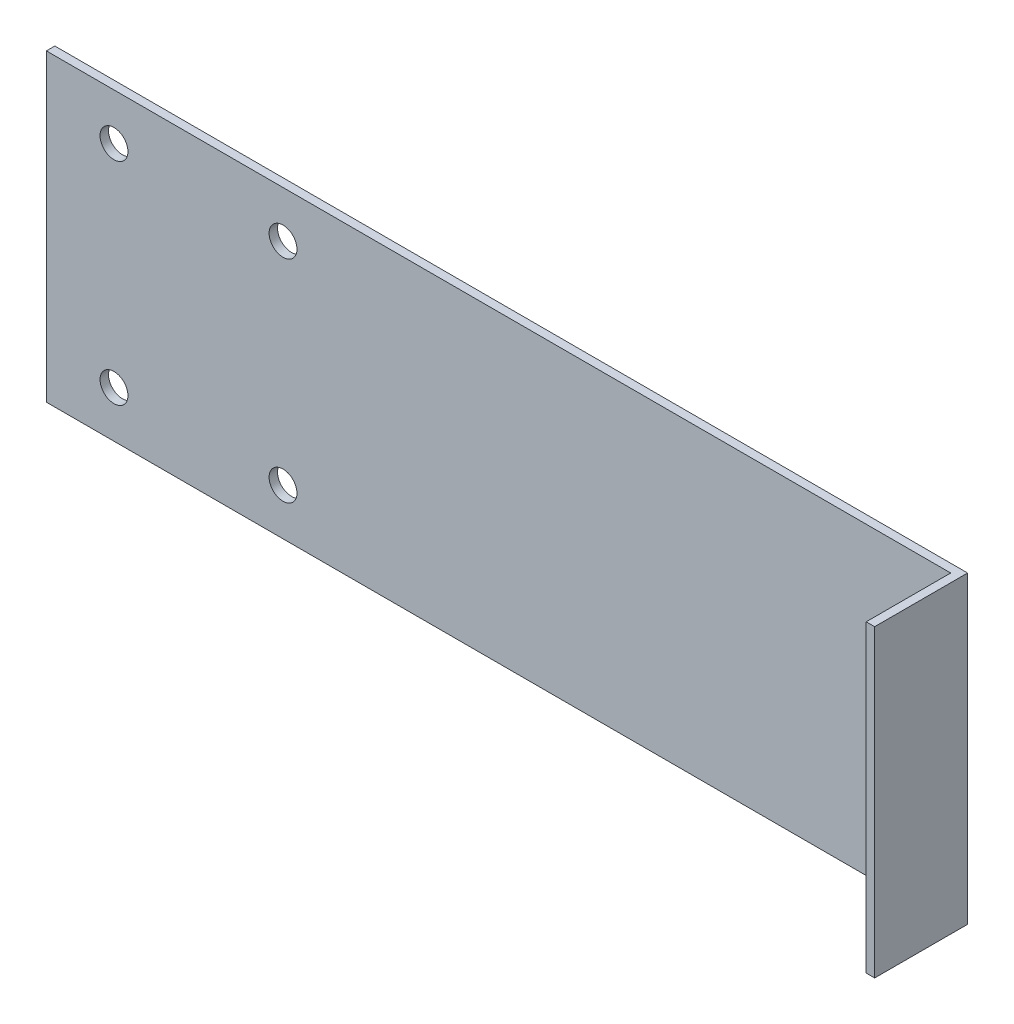
ISO-10303-21;
HEADER;
FILE_DESCRIPTION(('STEP AP214'),'2;1');
FILE_NAME('part.step','',(''),(''),'','','');
FILE_SCHEMA(('AUTOMOTIVE_DESIGN { 1 0 10303 214 1 1 1 1 }'));
ENDSEC;
DATA;
#1=APPLICATION_CONTEXT('core data for automotive mechanical design processes');
#2=APPLICATION_PROTOCOL_DEFINITION('international standard','automotive_design',2000,#1);
#3=PRODUCT_CONTEXT('',#1,'mechanical');
#4=PRODUCT('Part','Part','',(#3));
#5=PRODUCT_RELATED_PRODUCT_CATEGORY('part','',(#4));
#6=PRODUCT_DEFINITION_FORMATION('','',#4);
#7=PRODUCT_DEFINITION_CONTEXT('part definition',#1,'design');
#8=PRODUCT_DEFINITION('design','',#6,#7);
#9=PRODUCT_DEFINITION_SHAPE('','',#8);
#10=(LENGTH_UNIT() NAMED_UNIT(*) SI_UNIT(.MILLI.,.METRE.));
#11=(NAMED_UNIT(*) PLANE_ANGLE_UNIT() SI_UNIT($,.RADIAN.));
#12=(NAMED_UNIT(*) SI_UNIT($,.STERADIAN.) SOLID_ANGLE_UNIT());
#13=UNCERTAINTY_MEASURE_WITH_UNIT(LENGTH_MEASURE(1.E-05),#10,'distance_accuracy_value','');
#14=(GEOMETRIC_REPRESENTATION_CONTEXT(3) GLOBAL_UNCERTAINTY_ASSIGNED_CONTEXT((#13)) GLOBAL_UNIT_ASSIGNED_CONTEXT((#10,
#11,#12)) REPRESENTATION_CONTEXT('',''));
#15=CARTESIAN_POINT('',(0.,0.,0.));
#16=DIRECTION('',(0.,0.,1.));
#17=DIRECTION('',(1.,0.,0.));
#18=AXIS2_PLACEMENT_3D('',#15,#16,#17);
#19=CARTESIAN_POINT('',(54.,18.,1.));
#20=DIRECTION('',(-1.,0.,0.));
#21=DIRECTION('',(0.,-1.,0.));
#22=AXIS2_PLACEMENT_3D('',#19,#20,#21);
#23=PLANE('',#22);
#24=DIRECTION('',(0.,1.,0.));
#25=VECTOR('',#24,1.);
#26=CARTESIAN_POINT('',(54.,18.,0.));
#27=LINE('',#26,#25);
#28=CARTESIAN_POINT('',(54.,-18.,0.));
#29=VERTEX_POINT('',#28);
#30=CARTESIAN_POINT('',(54.,18.,0.));
#31=VERTEX_POINT('',#30);
#32=EDGE_CURVE('E96',#29,#31,#27,.T.);
#33=ORIENTED_EDGE('',*,*,#32,.T.);
#34=DIRECTION('',(0.,0.,-1.));
#35=VECTOR('',#34,1.);
#36=CARTESIAN_POINT('',(54.,18.,1.));
#37=LINE('',#36,#35);
#38=CARTESIAN_POINT('',(54.,18.,11.));
#39=VERTEX_POINT('',#38);
#40=EDGE_CURVE('E11',#39,#31,#37,.T.);
#41=ORIENTED_EDGE('',*,*,#40,.F.);
#42=DIRECTION('',(0.,1.,0.));
#43=VECTOR('',#42,1.);
#44=CARTESIAN_POINT('',(54.,18.,11.));
#45=LINE('',#44,#43);
#46=CARTESIAN_POINT('',(54.,-18.,11.));
#47=VERTEX_POINT('',#46);
#48=EDGE_CURVE('E98',#47,#39,#45,.T.);
#49=ORIENTED_EDGE('',*,*,#48,.F.);
#50=DIRECTION('',(0.,0.,-1.));
#51=VECTOR('',#50,1.);
#52=CARTESIAN_POINT('',(54.,-18.,1.));
#53=LINE('',#52,#51);
#54=EDGE_CURVE('E82',#47,#29,#53,.T.);
#55=ORIENTED_EDGE('',*,*,#54,.T.);
#56=EDGE_LOOP('',(#33,#41,#49,#55));
#57=FACE_BOUND('',#56,.T.);
#58=ADVANCED_FACE('F35',(#57),#23,.F.);
#59=CARTESIAN_POINT('',(-54.,18.,1.));
#60=DIRECTION('',(0.,-1.,0.));
#61=DIRECTION('',(0.,0.,-1.));
#62=AXIS2_PLACEMENT_3D('',#59,#60,#61);
#63=PLANE('',#62);
#64=DIRECTION('',(-1.,0.,0.));
#65=VECTOR('',#64,1.);
#66=CARTESIAN_POINT('',(-54.,18.,0.));
#67=LINE('',#66,#65);
#68=CARTESIAN_POINT('',(-54.,18.,0.));
#69=VERTEX_POINT('',#68);
#70=EDGE_CURVE('E102',#31,#69,#67,.T.);
#71=ORIENTED_EDGE('',*,*,#70,.T.);
#72=DIRECTION('',(0.,0.,-1.));
#73=VECTOR('',#72,1.);
#74=CARTESIAN_POINT('',(-54.,18.,1.));
#75=LINE('',#74,#73);
#76=CARTESIAN_POINT('',(-54.,18.,1.));
#77=VERTEX_POINT('',#76);
#78=EDGE_CURVE('E43',#77,#69,#75,.T.);
#79=ORIENTED_EDGE('',*,*,#78,.F.);
#80=DIRECTION('',(-1.,0.,0.));
#81=VECTOR('',#80,1.);
#82=CARTESIAN_POINT('',(-54.,18.,1.));
#83=LINE('',#82,#81);
#84=CARTESIAN_POINT('',(53.,18.,1.));
#85=VERTEX_POINT('',#84);
#86=EDGE_CURVE('E89',#85,#77,#83,.T.);
#87=ORIENTED_EDGE('',*,*,#86,.F.);
#88=DIRECTION('',(0.,0.,-1.));
#89=VECTOR('',#88,1.);
#90=CARTESIAN_POINT('',(53.,18.,11.));
#91=LINE('',#90,#89);
#92=CARTESIAN_POINT('',(53.,18.,11.));
#93=VERTEX_POINT('',#92);
#94=EDGE_CURVE('E134',#93,#85,#91,.T.);
#95=ORIENTED_EDGE('',*,*,#94,.F.);
#96=DIRECTION('',(-1.,0.,0.));
#97=VECTOR('',#96,1.);
#98=CARTESIAN_POINT('',(53.,18.,11.));
#99=LINE('',#98,#97);
#100=EDGE_CURVE('E147',#39,#93,#99,.T.);
#101=ORIENTED_EDGE('',*,*,#100,.F.);
#102=ORIENTED_EDGE('',*,*,#40,.T.);
#103=EDGE_LOOP('',(#71,#79,#87,#95,#101,#102));
#104=FACE_BOUND('',#103,.T.);
#105=ADVANCED_FACE('F183',(#104),#63,.F.);
#106=CARTESIAN_POINT('',(-54.,18.,1.));
#107=DIRECTION('',(1.,0.,0.));
#108=DIRECTION('',(0.,1.,0.));
#109=AXIS2_PLACEMENT_3D('',#106,#107,#108);
#110=PLANE('',#109);
#111=DIRECTION('',(0.,-1.,0.));
#112=VECTOR('',#111,1.);
#113=CARTESIAN_POINT('',(-54.,18.,0.));
#114=LINE('',#113,#112);
#115=CARTESIAN_POINT('',(-54.,-18.,0.));
#116=VERTEX_POINT('',#115);
#117=EDGE_CURVE('E90',#69,#116,#114,.T.);
#118=ORIENTED_EDGE('',*,*,#117,.T.);
#119=DIRECTION('',(0.,0.,-1.));
#120=VECTOR('',#119,1.);
#121=CARTESIAN_POINT('',(-54.,-18.,1.));
#122=LINE('',#121,#120);
#123=CARTESIAN_POINT('',(-54.,-18.,1.));
#124=VERTEX_POINT('',#123);
#125=EDGE_CURVE('E85',#124,#116,#122,.T.);
#126=ORIENTED_EDGE('',*,*,#125,.F.);
#127=DIRECTION('',(0.,-1.,0.));
#128=VECTOR('',#127,1.);
#129=CARTESIAN_POINT('',(-54.,18.,1.));
#130=LINE('',#129,#128);
#131=EDGE_CURVE('E57',#77,#124,#130,.T.);
#132=ORIENTED_EDGE('',*,*,#131,.F.);
#133=ORIENTED_EDGE('',*,*,#78,.T.);
#134=EDGE_LOOP('',(#118,#126,#132,#133));
#135=FACE_BOUND('',#134,.T.);
#136=ADVANCED_FACE('F179',(#135),#110,.F.);
#137=CARTESIAN_POINT('',(-54.,-18.,1.));
#138=DIRECTION('',(0.,1.,0.));
#139=DIRECTION('',(0.,0.,1.));
#140=AXIS2_PLACEMENT_3D('',#137,#138,#139);
#141=PLANE('',#140);
#142=DIRECTION('',(1.,0.,0.));
#143=VECTOR('',#142,1.);
#144=CARTESIAN_POINT('',(-54.,-18.,0.));
#145=LINE('',#144,#143);
#146=EDGE_CURVE('E77',#116,#29,#145,.T.);
#147=ORIENTED_EDGE('',*,*,#146,.T.);
#148=ORIENTED_EDGE('',*,*,#54,.F.);
#149=DIRECTION('',(1.,0.,0.));
#150=VECTOR('',#149,1.);
#151=CARTESIAN_POINT('',(53.,-18.,11.));
#152=LINE('',#151,#150);
#153=CARTESIAN_POINT('',(53.,-18.,11.));
#154=VERTEX_POINT('',#153);
#155=EDGE_CURVE('E129',#154,#47,#152,.T.);
#156=ORIENTED_EDGE('',*,*,#155,.F.);
#157=DIRECTION('',(0.,0.,-1.));
#158=VECTOR('',#157,1.);
#159=CARTESIAN_POINT('',(53.,-18.,11.));
#160=LINE('',#159,#158);
#161=CARTESIAN_POINT('',(53.,-18.,1.));
#162=VERTEX_POINT('',#161);
#163=EDGE_CURVE('E128',#154,#162,#160,.T.);
#164=ORIENTED_EDGE('',*,*,#163,.T.);
#165=DIRECTION('',(1.,0.,0.));
#166=VECTOR('',#165,1.);
#167=CARTESIAN_POINT('',(-54.,-18.,1.));
#168=LINE('',#167,#166);
#169=EDGE_CURVE('E99',#124,#162,#168,.T.);
#170=ORIENTED_EDGE('',*,*,#169,.F.);
#171=ORIENTED_EDGE('',*,*,#125,.T.);
#172=EDGE_LOOP('',(#147,#148,#156,#164,#170,#171));
#173=FACE_BOUND('',#172,.T.);
#174=ADVANCED_FACE('F79',(#173),#141,.F.);
#175=CARTESIAN_POINT('',(0.,0.,1.));
#176=DIRECTION('',(0.,0.,1.));
#177=DIRECTION('',(1.,0.,0.));
#178=AXIS2_PLACEMENT_3D('',#175,#176,#177);
#179=PLANE('',#178);
#180=DIRECTION('',(0.,-1.,0.));
#181=VECTOR('',#180,1.);
#182=CARTESIAN_POINT('',(53.,18.,1.));
#183=LINE('',#182,#181);
#184=EDGE_CURVE('E51',#85,#162,#183,.T.);
#185=ORIENTED_EDGE('',*,*,#184,.F.);
#186=ORIENTED_EDGE('',*,*,#86,.T.);
#187=ORIENTED_EDGE('',*,*,#131,.T.);
#188=ORIENTED_EDGE('',*,*,#169,.T.);
#189=EDGE_LOOP('',(#185,#186,#187,#188));
#190=FACE_BOUND('',#189,.T.);
#191=CARTESIAN_POINT('',(-46.,12.5,1.));
#192=DIRECTION('',(0.,0.,1.));
#193=DIRECTION('',(1.,0.,0.));
#194=AXIS2_PLACEMENT_3D('',#191,#192,#193);
#195=CIRCLE('',#194,1.64999999999999);
#196=CARTESIAN_POINT('',(-44.3500000000001,12.5,1.));
#197=VERTEX_POINT('',#196);
#198=EDGE_CURVE('E133',#197,#197,#195,.T.);
#199=ORIENTED_EDGE('',*,*,#198,.F.);
#200=EDGE_LOOP('',(#199));
#201=FACE_BOUND('',#200,.T.);
#202=CARTESIAN_POINT('',(-26.,12.5,1.));
#203=DIRECTION('',(0.,0.,1.));
#204=DIRECTION('',(1.,0.,0.));
#205=AXIS2_PLACEMENT_3D('',#202,#203,#204);
#206=CIRCLE('',#205,1.64999999999999);
#207=CARTESIAN_POINT('',(-24.3500000000001,12.5,1.));
#208=VERTEX_POINT('',#207);
#209=EDGE_CURVE('E154',#208,#208,#206,.T.);
#210=ORIENTED_EDGE('',*,*,#209,.F.);
#211=EDGE_LOOP('',(#210));
#212=FACE_BOUND('',#211,.T.);
#213=CARTESIAN_POINT('',(-46.,-12.5,1.));
#214=DIRECTION('',(0.,0.,1.));
#215=DIRECTION('',(1.,0.,0.));
#216=AXIS2_PLACEMENT_3D('',#213,#214,#215);
#217=CIRCLE('',#216,1.64999999999999);
#218=CARTESIAN_POINT('',(-44.3500000000001,-12.5,1.));
#219=VERTEX_POINT('',#218);
#220=EDGE_CURVE('E160',#219,#219,#217,.T.);
#221=ORIENTED_EDGE('',*,*,#220,.F.);
#222=EDGE_LOOP('',(#221));
#223=FACE_BOUND('',#222,.T.);
#224=CARTESIAN_POINT('',(-26.,-12.5,1.));
#225=DIRECTION('',(0.,0.,1.));
#226=DIRECTION('',(1.,0.,0.));
#227=AXIS2_PLACEMENT_3D('',#224,#225,#226);
#228=CIRCLE('',#227,1.64999999999999);
#229=CARTESIAN_POINT('',(-24.3500000000001,-12.5,1.));
#230=VERTEX_POINT('',#229);
#231=EDGE_CURVE('E107',#230,#230,#228,.T.);
#232=ORIENTED_EDGE('',*,*,#231,.F.);
#233=EDGE_LOOP('',(#232));
#234=FACE_BOUND('',#233,.T.);
#235=ADVANCED_FACE('F124',(#190,#201,#212,#223,#234),#179,.T.);
#236=CARTESIAN_POINT('',(0.,0.,0.));
#237=DIRECTION('',(0.,0.,1.));
#238=DIRECTION('',(1.,0.,0.));
#239=AXIS2_PLACEMENT_3D('',#236,#237,#238);
#240=PLANE('',#239);
#241=CARTESIAN_POINT('',(-46.,12.5,0.));
#242=DIRECTION('',(0.,0.,1.));
#243=DIRECTION('',(1.,0.,0.));
#244=AXIS2_PLACEMENT_3D('',#241,#242,#243);
#245=CIRCLE('',#244,1.64999999999999);
#246=CARTESIAN_POINT('',(-44.3500000000001,12.5,0.));
#247=VERTEX_POINT('',#246);
#248=EDGE_CURVE('E151',#247,#247,#245,.T.);
#249=ORIENTED_EDGE('',*,*,#248,.T.);
#250=EDGE_LOOP('',(#249));
#251=FACE_BOUND('',#250,.T.);
#252=CARTESIAN_POINT('',(-26.,12.5,0.));
#253=DIRECTION('',(0.,0.,1.));
#254=DIRECTION('',(1.,0.,0.));
#255=AXIS2_PLACEMENT_3D('',#252,#253,#254);
#256=CIRCLE('',#255,1.64999999999999);
#257=CARTESIAN_POINT('',(-24.3500000000001,12.5,0.));
#258=VERTEX_POINT('',#257);
#259=EDGE_CURVE('E157',#258,#258,#256,.T.);
#260=ORIENTED_EDGE('',*,*,#259,.T.);
#261=EDGE_LOOP('',(#260));
#262=FACE_BOUND('',#261,.T.);
#263=CARTESIAN_POINT('',(-46.,-12.5,0.));
#264=DIRECTION('',(0.,0.,1.));
#265=DIRECTION('',(1.,0.,0.));
#266=AXIS2_PLACEMENT_3D('',#263,#264,#265);
#267=CIRCLE('',#266,1.64999999999999);
#268=CARTESIAN_POINT('',(-44.3500000000001,-12.5,0.));
#269=VERTEX_POINT('',#268);
#270=EDGE_CURVE('E163',#269,#269,#267,.T.);
#271=ORIENTED_EDGE('',*,*,#270,.T.);
#272=EDGE_LOOP('',(#271));
#273=FACE_BOUND('',#272,.T.);
#274=CARTESIAN_POINT('',(-26.,-12.5,0.));
#275=DIRECTION('',(0.,0.,1.));
#276=DIRECTION('',(1.,0.,0.));
#277=AXIS2_PLACEMENT_3D('',#274,#275,#276);
#278=CIRCLE('',#277,1.64999999999999);
#279=CARTESIAN_POINT('',(-24.3500000000001,-12.5,0.));
#280=VERTEX_POINT('',#279);
#281=EDGE_CURVE('E103',#280,#280,#278,.T.);
#282=ORIENTED_EDGE('',*,*,#281,.T.);
#283=EDGE_LOOP('',(#282));
#284=FACE_BOUND('',#283,.T.);
#285=ORIENTED_EDGE('',*,*,#32,.F.);
#286=ORIENTED_EDGE('',*,*,#146,.F.);
#287=ORIENTED_EDGE('',*,*,#117,.F.);
#288=ORIENTED_EDGE('',*,*,#70,.F.);
#289=EDGE_LOOP('',(#285,#286,#287,#288));
#290=FACE_BOUND('',#289,.T.);
#291=ADVANCED_FACE('F101',(#251,#262,#273,#284,#290),#240,.F.);
#292=CARTESIAN_POINT('',(-26.,-12.5,1.));
#293=DIRECTION('',(0.,0.,1.));
#294=DIRECTION('',(1.,0.,0.));
#295=AXIS2_PLACEMENT_3D('',#292,#293,#294);
#296=CYLINDRICAL_SURFACE('',#295,1.64999999999999);
#297=ORIENTED_EDGE('',*,*,#231,.T.);
#298=EDGE_LOOP('',(#297));
#299=FACE_BOUND('',#298,.T.);
#300=ORIENTED_EDGE('',*,*,#281,.F.);
#301=EDGE_LOOP('',(#300));
#302=FACE_BOUND('',#301,.T.);
#303=ADVANCED_FACE('F168',(#299,#302),#296,.F.);
#304=CARTESIAN_POINT('',(-46.,-12.5,1.));
#305=DIRECTION('',(0.,0.,1.));
#306=DIRECTION('',(1.,0.,0.));
#307=AXIS2_PLACEMENT_3D('',#304,#305,#306);
#308=CYLINDRICAL_SURFACE('',#307,1.64999999999999);
#309=ORIENTED_EDGE('',*,*,#220,.T.);
#310=EDGE_LOOP('',(#309));
#311=FACE_BOUND('',#310,.T.);
#312=ORIENTED_EDGE('',*,*,#270,.F.);
#313=EDGE_LOOP('',(#312));
#314=FACE_BOUND('',#313,.T.);
#315=ADVANCED_FACE('F218',(#311,#314),#308,.F.);
#316=CARTESIAN_POINT('',(-26.,12.5,1.));
#317=DIRECTION('',(0.,0.,1.));
#318=DIRECTION('',(1.,0.,0.));
#319=AXIS2_PLACEMENT_3D('',#316,#317,#318);
#320=CYLINDRICAL_SURFACE('',#319,1.64999999999999);
#321=ORIENTED_EDGE('',*,*,#209,.T.);
#322=EDGE_LOOP('',(#321));
#323=FACE_BOUND('',#322,.T.);
#324=ORIENTED_EDGE('',*,*,#259,.F.);
#325=EDGE_LOOP('',(#324));
#326=FACE_BOUND('',#325,.T.);
#327=ADVANCED_FACE('F214',(#323,#326),#320,.F.);
#328=CARTESIAN_POINT('',(-46.,12.5,1.));
#329=DIRECTION('',(0.,0.,1.));
#330=DIRECTION('',(1.,0.,0.));
#331=AXIS2_PLACEMENT_3D('',#328,#329,#330);
#332=CYLINDRICAL_SURFACE('',#331,1.64999999999999);
#333=ORIENTED_EDGE('',*,*,#198,.T.);
#334=EDGE_LOOP('',(#333));
#335=FACE_BOUND('',#334,.T.);
#336=ORIENTED_EDGE('',*,*,#248,.F.);
#337=EDGE_LOOP('',(#336));
#338=FACE_BOUND('',#337,.T.);
#339=ADVANCED_FACE('F209',(#335,#338),#332,.F.);
#340=CARTESIAN_POINT('',(53.,18.,11.));
#341=DIRECTION('',(1.,0.,0.));
#342=DIRECTION('',(0.,1.,0.));
#343=AXIS2_PLACEMENT_3D('',#340,#341,#342);
#344=PLANE('',#343);
#345=ORIENTED_EDGE('',*,*,#184,.T.);
#346=ORIENTED_EDGE('',*,*,#163,.F.);
#347=DIRECTION('',(0.,-1.,0.));
#348=VECTOR('',#347,1.);
#349=CARTESIAN_POINT('',(53.,18.,11.));
#350=LINE('',#349,#348);
#351=EDGE_CURVE('E138',#93,#154,#350,.T.);
#352=ORIENTED_EDGE('',*,*,#351,.F.);
#353=ORIENTED_EDGE('',*,*,#94,.T.);
#354=EDGE_LOOP('',(#345,#346,#352,#353));
#355=FACE_BOUND('',#354,.T.);
#356=ADVANCED_FACE('F136',(#355),#344,.F.);
#357=CARTESIAN_POINT('',(0.,0.,11.));
#358=DIRECTION('',(0.,0.,1.));
#359=DIRECTION('',(1.,0.,0.));
#360=AXIS2_PLACEMENT_3D('',#357,#358,#359);
#361=PLANE('',#360);
#362=ORIENTED_EDGE('',*,*,#351,.T.);
#363=ORIENTED_EDGE('',*,*,#155,.T.);
#364=ORIENTED_EDGE('',*,*,#48,.T.);
#365=ORIENTED_EDGE('',*,*,#100,.T.);
#366=EDGE_LOOP('',(#362,#363,#364,#365));
#367=FACE_BOUND('',#366,.T.);
#368=ADVANCED_FACE('F199',(#367),#361,.T.);
#369=CLOSED_SHELL('',(#58,#105,#136,#174,#235,#291,#303,#315,#327,#339,#356,#368));
#370=MANIFOLD_SOLID_BREP('B2',#369);
#371=ADVANCED_BREP_SHAPE_REPRESENTATION('',(#18,#370),#14);
#372=SHAPE_DEFINITION_REPRESENTATION(#9,#371);
ENDSEC;
END-ISO-10303-21;
